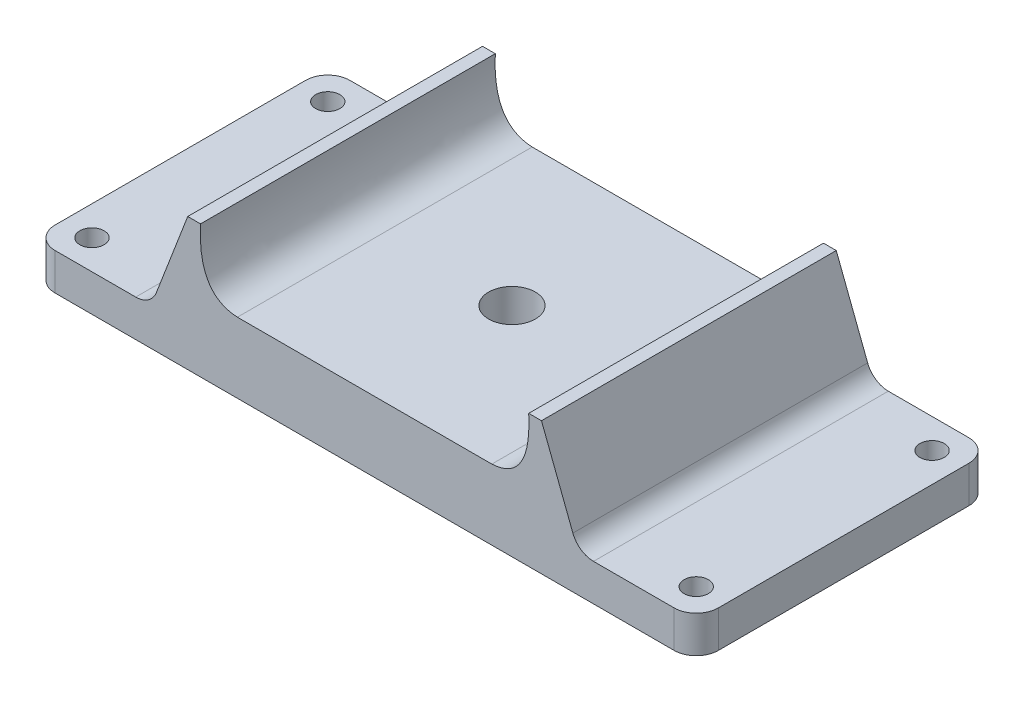
ISO-10303-21;
HEADER;
FILE_DESCRIPTION(('STEP AP214'),'2;1');
FILE_NAME('part.step','',(''),(''),'','','');
FILE_SCHEMA(('AUTOMOTIVE_DESIGN { 1 0 10303 214 1 1 1 1 }'));
ENDSEC;
DATA;
#1=APPLICATION_CONTEXT('core data for automotive mechanical design processes');
#2=APPLICATION_PROTOCOL_DEFINITION('international standard','automotive_design',2000,#1);
#3=PRODUCT_CONTEXT('',#1,'mechanical');
#4=PRODUCT('Part','Part','',(#3));
#5=PRODUCT_RELATED_PRODUCT_CATEGORY('part','',(#4));
#6=PRODUCT_DEFINITION_FORMATION('','',#4);
#7=PRODUCT_DEFINITION_CONTEXT('part definition',#1,'design');
#8=PRODUCT_DEFINITION('design','',#6,#7);
#9=PRODUCT_DEFINITION_SHAPE('','',#8);
#10=(LENGTH_UNIT() NAMED_UNIT(*) SI_UNIT(.MILLI.,.METRE.));
#11=(NAMED_UNIT(*) PLANE_ANGLE_UNIT() SI_UNIT($,.RADIAN.));
#12=(NAMED_UNIT(*) SI_UNIT($,.STERADIAN.) SOLID_ANGLE_UNIT());
#13=UNCERTAINTY_MEASURE_WITH_UNIT(LENGTH_MEASURE(1.E-05),#10,'distance_accuracy_value','');
#14=(GEOMETRIC_REPRESENTATION_CONTEXT(3) GLOBAL_UNCERTAINTY_ASSIGNED_CONTEXT((#13)) GLOBAL_UNIT_ASSIGNED_CONTEXT((#10,
#11,#12)) REPRESENTATION_CONTEXT('',''));
#15=CARTESIAN_POINT('',(0.,0.,0.));
#16=DIRECTION('',(0.,0.,1.));
#17=DIRECTION('',(1.,0.,0.));
#18=AXIS2_PLACEMENT_3D('',#15,#16,#17);
#19=CARTESIAN_POINT('',(0.,18.,0.));
#20=DIRECTION('',(0.,1.,0.));
#21=DIRECTION('',(0.,0.,1.));
#22=AXIS2_PLACEMENT_3D('',#19,#20,#21);
#23=PLANE('',#22);
#24=DIRECTION('',(0.,0.,1.));
#25=VECTOR('',#24,1.);
#26=CARTESIAN_POINT('',(-22.2664421870811,18.,-32.));
#27=LINE('',#26,#25);
#28=CARTESIAN_POINT('',(-22.2664421870811,18.,-20.));
#29=VERTEX_POINT('',#28);
#30=CARTESIAN_POINT('',(-22.2664421870811,18.,20.));
#31=VERTEX_POINT('',#30);
#32=EDGE_CURVE('E196',#29,#31,#27,.T.);
#33=ORIENTED_EDGE('',*,*,#32,.F.);
#34=DIRECTION('',(1.,0.,0.));
#35=VECTOR('',#34,1.);
#36=CARTESIAN_POINT('',(0.,18.,-20.));
#37=LINE('',#36,#35);
#38=CARTESIAN_POINT('',(-24.,18.,-20.));
#39=VERTEX_POINT('',#38);
#40=EDGE_CURVE('E273',#39,#29,#37,.T.);
#41=ORIENTED_EDGE('',*,*,#40,.F.);
#42=DIRECTION('',(0.,0.,1.));
#43=VECTOR('',#42,1.);
#44=CARTESIAN_POINT('',(-24.,18.,0.));
#45=LINE('',#44,#43);
#46=CARTESIAN_POINT('',(-24.,18.,20.));
#47=VERTEX_POINT('',#46);
#48=EDGE_CURVE('E277',#39,#47,#45,.T.);
#49=ORIENTED_EDGE('',*,*,#48,.T.);
#50=DIRECTION('',(1.,0.,0.));
#51=VECTOR('',#50,1.);
#52=CARTESIAN_POINT('',(0.,18.,20.));
#53=LINE('',#52,#51);
#54=EDGE_CURVE('E282',#47,#31,#53,.T.);
#55=ORIENTED_EDGE('',*,*,#54,.T.);
#56=EDGE_LOOP('',(#33,#41,#49,#55));
#57=FACE_BOUND('',#56,.T.);
#58=ADVANCED_FACE('F49',(#57),#23,.T.);
#59=CARTESIAN_POINT('',(0.,5.,-20.));
#60=DIRECTION('',(0.,0.,-1.));
#61=DIRECTION('',(-1.,0.,0.));
#62=AXIS2_PLACEMENT_3D('',#59,#60,#61);
#63=PLANE('',#62);
#64=DIRECTION('',(1.,0.,0.));
#65=VECTOR('',#64,1.);
#66=CARTESIAN_POINT('',(0.,0.,-20.));
#67=LINE('',#66,#65);
#68=CARTESIAN_POINT('',(-42.,0.,-20.));
#69=VERTEX_POINT('',#68);
#70=CARTESIAN_POINT('',(42.,0.,-20.));
#71=VERTEX_POINT('',#70);
#72=EDGE_CURVE('E285',#69,#71,#67,.T.);
#73=ORIENTED_EDGE('',*,*,#72,.F.);
#74=DIRECTION('',(0.,-1.,0.));
#75=VECTOR('',#74,1.);
#76=CARTESIAN_POINT('',(-42.,5.,-20.));
#77=LINE('',#76,#75);
#78=CARTESIAN_POINT('',(-42.,5.,-20.));
#79=VERTEX_POINT('',#78);
#80=EDGE_CURVE('E397',#69,#79,#77,.F.);
#81=ORIENTED_EDGE('',*,*,#80,.T.);
#82=DIRECTION('',(1.,0.,0.));
#83=VECTOR('',#82,1.);
#84=CARTESIAN_POINT('',(0.,5.,-20.));
#85=LINE('',#84,#83);
#86=CARTESIAN_POINT('',(-31.0603972947348,5.,-20.));
#87=VERTEX_POINT('',#86);
#88=EDGE_CURVE('E289',#79,#87,#85,.T.);
#89=ORIENTED_EDGE('',*,*,#88,.T.);
#90=CARTESIAN_POINT('',(-31.0603972947348,8.,-20.));
#91=DIRECTION('',(0.,0.,-1.));
#92=DIRECTION('',(-1.,0.,0.));
#93=AXIS2_PLACEMENT_3D('',#90,#91,#92);
#94=CIRCLE('',#93,3.);
#95=CARTESIAN_POINT('',(-28.2603604761256,6.92306276207338,-20.));
#96=VERTEX_POINT('',#95);
#97=EDGE_CURVE('E361',#87,#96,#94,.F.);
#98=ORIENTED_EDGE('',*,*,#97,.T.);
#99=DIRECTION('',(0.358979079308872,0.933345606203059,0.));
#100=VECTOR('',#99,1.);
#101=CARTESIAN_POINT('',(-24.,17.9999999999999,-20.));
#102=LINE('',#101,#100);
#103=EDGE_CURVE('E337',#96,#39,#102,.T.);
#104=ORIENTED_EDGE('',*,*,#103,.T.);
#105=ORIENTED_EDGE('',*,*,#40,.T.);
#106=CARTESIAN_POINT('',(-22.2664421870811,18.,-20.));
#107=CARTESIAN_POINT('',(-22.7015379766122,9.81972085349256,-20.));
#108=CARTESIAN_POINT('',(-17.2629045058751,9.53381189618557,-20.));
#109=B_SPLINE_CURVE_WITH_KNOTS('',2,(#106,#107,#108),.UNSPECIFIED.,.F.,.F.,(3,3),(0.,1.),.UNSPECIFIED.);
#110=CARTESIAN_POINT('',(-17.2629045058751,9.53381189618557,-20.));
#111=VERTEX_POINT('',#110);
#112=EDGE_CURVE('E223',#111,#29,#109,.F.);
#113=ORIENTED_EDGE('',*,*,#112,.F.);
#114=DIRECTION('',(-1.,0.,0.));
#115=VECTOR('',#114,1.);
#116=CARTESIAN_POINT('',(0.,9.53381189618557,-20.));
#117=LINE('',#116,#115);
#118=CARTESIAN_POINT('',(17.2629045058751,9.53381189618557,-20.));
#119=VERTEX_POINT('',#118);
#120=EDGE_CURVE('E185',#119,#111,#117,.T.);
#121=ORIENTED_EDGE('',*,*,#120,.F.);
#122=CARTESIAN_POINT('',(17.2629045058751,9.53381189618557,-20.));
#123=CARTESIAN_POINT('',(22.7015379766122,9.81972085349256,-20.));
#124=CARTESIAN_POINT('',(22.2664421870811,18.,-20.));
#125=B_SPLINE_CURVE_WITH_KNOTS('',2,(#122,#123,#124),.UNSPECIFIED.,.F.,.F.,(3,3),(0.,1.),.UNSPECIFIED.);
#126=CARTESIAN_POINT('',(22.2664421870811,18.,-20.));
#127=VERTEX_POINT('',#126);
#128=EDGE_CURVE('E217',#127,#119,#125,.F.);
#129=ORIENTED_EDGE('',*,*,#128,.F.);
#130=CARTESIAN_POINT('',(24.,18.,-20.));
#131=VERTEX_POINT('',#130);
#132=EDGE_CURVE('E272',#127,#131,#37,.T.);
#133=ORIENTED_EDGE('',*,*,#132,.T.);
#134=DIRECTION('',(-0.358979079308872,0.933345606203059,0.));
#135=VECTOR('',#134,1.);
#136=CARTESIAN_POINT('',(29.,5.,-20.));
#137=LINE('',#136,#135);
#138=CARTESIAN_POINT('',(28.2603604761256,6.92306276207338,-20.));
#139=VERTEX_POINT('',#138);
#140=EDGE_CURVE('E343',#131,#139,#137,.F.);
#141=ORIENTED_EDGE('',*,*,#140,.T.);
#142=CARTESIAN_POINT('',(31.0603972947348,8.,-20.));
#143=DIRECTION('',(0.,0.,-1.));
#144=DIRECTION('',(-1.,0.,0.));
#145=AXIS2_PLACEMENT_3D('',#142,#143,#144);
#146=CIRCLE('',#145,3.);
#147=CARTESIAN_POINT('',(31.0603972947348,5.,-20.));
#148=VERTEX_POINT('',#147);
#149=EDGE_CURVE('E371',#139,#148,#146,.F.);
#150=ORIENTED_EDGE('',*,*,#149,.T.);
#151=DIRECTION('',(1.,0.,0.));
#152=VECTOR('',#151,1.);
#153=CARTESIAN_POINT('',(0.,5.,-20.));
#154=LINE('',#153,#152);
#155=CARTESIAN_POINT('',(42.,5.,-20.));
#156=VERTEX_POINT('',#155);
#157=EDGE_CURVE('E242',#148,#156,#154,.T.);
#158=ORIENTED_EDGE('',*,*,#157,.T.);
#159=DIRECTION('',(0.,-1.,0.));
#160=VECTOR('',#159,1.);
#161=CARTESIAN_POINT('',(42.,5.,-20.));
#162=LINE('',#161,#160);
#163=EDGE_CURVE('E393',#156,#71,#162,.T.);
#164=ORIENTED_EDGE('',*,*,#163,.T.);
#165=EDGE_LOOP('',(#73,#81,#89,#98,#104,#105,#113,#121,#129,#133,#141,#150,#158,#164));
#166=FACE_BOUND('',#165,.T.);
#167=ADVANCED_FACE('F444',(#166),#63,.T.);
#168=CARTESIAN_POINT('',(-45.,5.,0.));
#169=DIRECTION('',(1.,0.,0.));
#170=DIRECTION('',(0.,0.,-1.));
#171=AXIS2_PLACEMENT_3D('',#168,#169,#170);
#172=PLANE('',#171);
#173=DIRECTION('',(0.,0.,1.));
#174=VECTOR('',#173,1.);
#175=CARTESIAN_POINT('',(-45.,5.,0.));
#176=LINE('',#175,#174);
#177=CARTESIAN_POINT('',(-45.,5.,-17.));
#178=VERTEX_POINT('',#177);
#179=CARTESIAN_POINT('',(-45.,5.,17.));
#180=VERTEX_POINT('',#179);
#181=EDGE_CURVE('E292',#178,#180,#176,.T.);
#182=ORIENTED_EDGE('',*,*,#181,.F.);
#183=DIRECTION('',(0.,-1.,0.));
#184=VECTOR('',#183,1.);
#185=CARTESIAN_POINT('',(-45.,0.,-17.));
#186=LINE('',#185,#184);
#187=CARTESIAN_POINT('',(-45.,0.,-17.));
#188=VERTEX_POINT('',#187);
#189=EDGE_CURVE('E377',#178,#188,#186,.T.);
#190=ORIENTED_EDGE('',*,*,#189,.T.);
#191=DIRECTION('',(0.,0.,1.));
#192=VECTOR('',#191,1.);
#193=CARTESIAN_POINT('',(-45.,0.,0.));
#194=LINE('',#193,#192);
#195=CARTESIAN_POINT('',(-45.,0.,17.));
#196=VERTEX_POINT('',#195);
#197=EDGE_CURVE('E312',#188,#196,#194,.T.);
#198=ORIENTED_EDGE('',*,*,#197,.T.);
#199=DIRECTION('',(0.,-1.,0.));
#200=VECTOR('',#199,1.);
#201=CARTESIAN_POINT('',(-45.,5.,17.));
#202=LINE('',#201,#200);
#203=EDGE_CURVE('E374',#196,#180,#202,.F.);
#204=ORIENTED_EDGE('',*,*,#203,.T.);
#205=EDGE_LOOP('',(#182,#190,#198,#204));
#206=FACE_BOUND('',#205,.T.);
#207=ADVANCED_FACE('F452',(#206),#172,.F.);
#208=CARTESIAN_POINT('',(-41.,5.,-16.));
#209=DIRECTION('',(0.,-1.,0.));
#210=DIRECTION('',(0.,0.,-1.));
#211=AXIS2_PLACEMENT_3D('',#208,#209,#210);
#212=CYLINDRICAL_SURFACE('',#211,1.65);
#213=CARTESIAN_POINT('',(-41.,5.,-16.));
#214=DIRECTION('',(0.,1.,0.));
#215=DIRECTION('',(0.,0.,1.));
#216=AXIS2_PLACEMENT_3D('',#213,#214,#215);
#217=CIRCLE('',#216,1.65);
#218=CARTESIAN_POINT('',(-41.,5.,-14.35));
#219=VERTEX_POINT('',#218);
#220=EDGE_CURVE('E300',#219,#219,#217,.T.);
#221=ORIENTED_EDGE('',*,*,#220,.T.);
#222=EDGE_LOOP('',(#221));
#223=FACE_BOUND('',#222,.T.);
#224=CARTESIAN_POINT('',(-41.,0.,-16.));
#225=DIRECTION('',(0.,1.,0.));
#226=DIRECTION('',(0.,0.,1.));
#227=AXIS2_PLACEMENT_3D('',#224,#225,#226);
#228=CIRCLE('',#227,1.65);
#229=CARTESIAN_POINT('',(-41.,0.,-14.35));
#230=VERTEX_POINT('',#229);
#231=EDGE_CURVE('E319',#230,#230,#228,.T.);
#232=ORIENTED_EDGE('',*,*,#231,.F.);
#233=EDGE_LOOP('',(#232));
#234=FACE_BOUND('',#233,.T.);
#235=ADVANCED_FACE('F657',(#223,#234),#212,.F.);
#236=CARTESIAN_POINT('',(0.,5.,20.));
#237=DIRECTION('',(0.,0.,-1.));
#238=DIRECTION('',(-1.,0.,0.));
#239=AXIS2_PLACEMENT_3D('',#236,#237,#238);
#240=PLANE('',#239);
#241=DIRECTION('',(1.,0.,0.));
#242=VECTOR('',#241,1.);
#243=CARTESIAN_POINT('',(0.,0.,20.));
#244=LINE('',#243,#242);
#245=CARTESIAN_POINT('',(-42.,0.,20.));
#246=VERTEX_POINT('',#245);
#247=CARTESIAN_POINT('',(42.,0.,20.));
#248=VERTEX_POINT('',#247);
#249=EDGE_CURVE('E316',#246,#248,#244,.T.);
#250=ORIENTED_EDGE('',*,*,#249,.T.);
#251=DIRECTION('',(0.,-1.,0.));
#252=VECTOR('',#251,1.);
#253=CARTESIAN_POINT('',(42.,5.,20.));
#254=LINE('',#253,#252);
#255=CARTESIAN_POINT('',(42.,5.,20.));
#256=VERTEX_POINT('',#255);
#257=EDGE_CURVE('E11',#248,#256,#254,.F.);
#258=ORIENTED_EDGE('',*,*,#257,.T.);
#259=DIRECTION('',(1.,0.,0.));
#260=VECTOR('',#259,1.);
#261=CARTESIAN_POINT('',(0.,5.,20.));
#262=LINE('',#261,#260);
#263=CARTESIAN_POINT('',(31.0603972947348,5.,20.));
#264=VERTEX_POINT('',#263);
#265=EDGE_CURVE('E247',#264,#256,#262,.T.);
#266=ORIENTED_EDGE('',*,*,#265,.F.);
#267=CARTESIAN_POINT('',(31.0603972947348,8.,20.));
#268=DIRECTION('',(0.,0.,-1.));
#269=DIRECTION('',(-1.,0.,0.));
#270=AXIS2_PLACEMENT_3D('',#267,#268,#269);
#271=CIRCLE('',#270,3.);
#272=CARTESIAN_POINT('',(28.2603604761256,6.92306276207338,20.));
#273=VERTEX_POINT('',#272);
#274=EDGE_CURVE('E368',#264,#273,#271,.T.);
#275=ORIENTED_EDGE('',*,*,#274,.T.);
#276=DIRECTION('',(0.358979079308872,-0.933345606203059,0.));
#277=VECTOR('',#276,1.);
#278=CARTESIAN_POINT('',(25.2628865979381,14.7164948453609,20.));
#279=LINE('',#278,#277);
#280=CARTESIAN_POINT('',(24.,18.,20.));
#281=VERTEX_POINT('',#280);
#282=EDGE_CURVE('E340',#273,#281,#279,.F.);
#283=ORIENTED_EDGE('',*,*,#282,.T.);
#284=CARTESIAN_POINT('',(22.2664421870811,18.,20.));
#285=VERTEX_POINT('',#284);
#286=EDGE_CURVE('E281',#285,#281,#53,.T.);
#287=ORIENTED_EDGE('',*,*,#286,.F.);
#288=CARTESIAN_POINT('',(17.2629045058751,9.53381189618557,20.));
#289=CARTESIAN_POINT('',(22.7015379766122,9.81972085349256,20.));
#290=CARTESIAN_POINT('',(22.2664421870811,18.,20.));
#291=B_SPLINE_CURVE_WITH_KNOTS('',2,(#288,#289,#290),.UNSPECIFIED.,.F.,.F.,(3,3),(0.,1.),.UNSPECIFIED.);
#292=CARTESIAN_POINT('',(17.2629045058751,9.53381189618557,20.));
#293=VERTEX_POINT('',#292);
#294=EDGE_CURVE('E190',#293,#285,#291,.T.);
#295=ORIENTED_EDGE('',*,*,#294,.F.);
#296=DIRECTION('',(1.,0.,0.));
#297=VECTOR('',#296,1.);
#298=CARTESIAN_POINT('',(-17.2629045058751,9.53381189618557,20.));
#299=LINE('',#298,#297);
#300=CARTESIAN_POINT('',(-17.2629045058751,9.53381189618557,20.));
#301=VERTEX_POINT('',#300);
#302=EDGE_CURVE('E182',#301,#293,#299,.T.);
#303=ORIENTED_EDGE('',*,*,#302,.F.);
#304=CARTESIAN_POINT('',(-22.2664421870811,18.,20.));
#305=CARTESIAN_POINT('',(-22.7015379766122,9.81972085349256,20.));
#306=CARTESIAN_POINT('',(-17.2629045058751,9.53381189618557,20.));
#307=B_SPLINE_CURVE_WITH_KNOTS('',2,(#304,#305,#306),.UNSPECIFIED.,.F.,.F.,(3,3),(0.,1.),.UNSPECIFIED.);
#308=EDGE_CURVE('E193',#31,#301,#307,.T.);
#309=ORIENTED_EDGE('',*,*,#308,.F.);
#310=ORIENTED_EDGE('',*,*,#54,.F.);
#311=DIRECTION('',(-0.358979079308872,-0.933345606203059,0.));
#312=VECTOR('',#311,1.);
#313=CARTESIAN_POINT('',(-25.2628865979381,14.7164948453609,20.));
#314=LINE('',#313,#312);
#315=CARTESIAN_POINT('',(-28.2603604761256,6.92306276207338,20.));
#316=VERTEX_POINT('',#315);
#317=EDGE_CURVE('E330',#47,#316,#314,.T.);
#318=ORIENTED_EDGE('',*,*,#317,.T.);
#319=CARTESIAN_POINT('',(-31.0603972947348,8.,20.));
#320=DIRECTION('',(0.,0.,-1.));
#321=DIRECTION('',(-1.,0.,0.));
#322=AXIS2_PLACEMENT_3D('',#319,#320,#321);
#323=CIRCLE('',#322,3.);
#324=CARTESIAN_POINT('',(-31.0603972947348,5.,20.));
#325=VERTEX_POINT('',#324);
#326=EDGE_CURVE('E364',#316,#325,#323,.T.);
#327=ORIENTED_EDGE('',*,*,#326,.T.);
#328=DIRECTION('',(1.,0.,0.));
#329=VECTOR('',#328,1.);
#330=CARTESIAN_POINT('',(0.,5.,20.));
#331=LINE('',#330,#329);
#332=CARTESIAN_POINT('',(-42.,5.,20.));
#333=VERTEX_POINT('',#332);
#334=EDGE_CURVE('E297',#333,#325,#331,.T.);
#335=ORIENTED_EDGE('',*,*,#334,.F.);
#336=DIRECTION('',(0.,-1.,0.));
#337=VECTOR('',#336,1.);
#338=CARTESIAN_POINT('',(-42.,5.,20.));
#339=LINE('',#338,#337);
#340=EDGE_CURVE('E58',#333,#246,#339,.T.);
#341=ORIENTED_EDGE('',*,*,#340,.T.);
#342=EDGE_LOOP('',(#250,#258,#266,#275,#283,#287,#295,#303,#309,#310,#318,#327,#335,#341));
#343=FACE_BOUND('',#342,.T.);
#344=ADVANCED_FACE('F201',(#343),#240,.F.);
#345=CARTESIAN_POINT('',(-41.,5.,16.));
#346=DIRECTION('',(0.,-1.,0.));
#347=DIRECTION('',(0.,0.,-1.));
#348=AXIS2_PLACEMENT_3D('',#345,#346,#347);
#349=CYLINDRICAL_SURFACE('',#348,1.65);
#350=CARTESIAN_POINT('',(-41.,5.,16.));
#351=DIRECTION('',(0.,1.,0.));
#352=DIRECTION('',(0.,0.,1.));
#353=AXIS2_PLACEMENT_3D('',#350,#351,#352);
#354=CIRCLE('',#353,1.65);
#355=CARTESIAN_POINT('',(-41.,5.,17.65));
#356=VERTEX_POINT('',#355);
#357=EDGE_CURVE('E304',#356,#356,#354,.F.);
#358=ORIENTED_EDGE('',*,*,#357,.F.);
#359=EDGE_LOOP('',(#358));
#360=FACE_BOUND('',#359,.T.);
#361=CARTESIAN_POINT('',(-41.,0.,16.));
#362=DIRECTION('',(0.,1.,0.));
#363=DIRECTION('',(0.,0.,1.));
#364=AXIS2_PLACEMENT_3D('',#361,#362,#363);
#365=CIRCLE('',#364,1.65);
#366=CARTESIAN_POINT('',(-41.,0.,17.65));
#367=VERTEX_POINT('',#366);
#368=EDGE_CURVE('E293',#367,#367,#365,.F.);
#369=ORIENTED_EDGE('',*,*,#368,.T.);
#370=EDGE_LOOP('',(#369));
#371=FACE_BOUND('',#370,.T.);
#372=ADVANCED_FACE('F642',(#360,#371),#349,.F.);
#373=CARTESIAN_POINT('',(0.,5.,0.));
#374=DIRECTION('',(0.,1.,0.));
#375=DIRECTION('',(0.,0.,1.));
#376=AXIS2_PLACEMENT_3D('',#373,#374,#375);
#377=PLANE('',#376);
#378=ORIENTED_EDGE('',*,*,#88,.F.);
#379=CARTESIAN_POINT('',(-42.,5.,-17.));
#380=DIRECTION('',(0.,1.,0.));
#381=DIRECTION('',(0.,0.,1.));
#382=AXIS2_PLACEMENT_3D('',#379,#380,#381);
#383=CIRCLE('',#382,3.);
#384=EDGE_CURVE('E403',#79,#178,#383,.T.);
#385=ORIENTED_EDGE('',*,*,#384,.T.);
#386=ORIENTED_EDGE('',*,*,#181,.T.);
#387=CARTESIAN_POINT('',(-42.,5.,17.));
#388=DIRECTION('',(0.,1.,0.));
#389=DIRECTION('',(0.,0.,1.));
#390=AXIS2_PLACEMENT_3D('',#387,#388,#389);
#391=CIRCLE('',#390,3.);
#392=EDGE_CURVE('E400',#180,#333,#391,.T.);
#393=ORIENTED_EDGE('',*,*,#392,.T.);
#394=ORIENTED_EDGE('',*,*,#334,.T.);
#395=DIRECTION('',(0.,0.,-1.));
#396=VECTOR('',#395,1.);
#397=CARTESIAN_POINT('',(-31.0603972947348,5.,0.));
#398=LINE('',#397,#396);
#399=EDGE_CURVE('E347',#325,#87,#398,.T.);
#400=ORIENTED_EDGE('',*,*,#399,.T.);
#401=EDGE_LOOP('',(#378,#385,#386,#393,#394,#400));
#402=FACE_BOUND('',#401,.T.);
#403=ORIENTED_EDGE('',*,*,#220,.F.);
#404=EDGE_LOOP('',(#403));
#405=FACE_BOUND('',#404,.T.);
#406=ORIENTED_EDGE('',*,*,#357,.T.);
#407=EDGE_LOOP('',(#406));
#408=FACE_BOUND('',#407,.T.);
#409=ADVANCED_FACE('F456',(#402,#405,#408),#377,.T.);
#410=CARTESIAN_POINT('',(0.,0.,0.));
#411=DIRECTION('',(0.,1.,0.));
#412=DIRECTION('',(0.,0.,1.));
#413=AXIS2_PLACEMENT_3D('',#410,#411,#412);
#414=PLANE('',#413);
#415=ORIENTED_EDGE('',*,*,#197,.F.);
#416=CARTESIAN_POINT('',(-42.,0.,-17.));
#417=DIRECTION('',(0.,1.,0.));
#418=DIRECTION('',(0.,0.,1.));
#419=AXIS2_PLACEMENT_3D('',#416,#417,#418);
#420=CIRCLE('',#419,3.);
#421=EDGE_CURVE('E390',#188,#69,#420,.F.);
#422=ORIENTED_EDGE('',*,*,#421,.T.);
#423=ORIENTED_EDGE('',*,*,#72,.T.);
#424=CARTESIAN_POINT('',(42.,0.,-17.));
#425=DIRECTION('',(0.,1.,0.));
#426=DIRECTION('',(0.,0.,1.));
#427=AXIS2_PLACEMENT_3D('',#424,#425,#426);
#428=CIRCLE('',#427,3.);
#429=CARTESIAN_POINT('',(45.,0.,-17.));
#430=VERTEX_POINT('',#429);
#431=EDGE_CURVE('E387',#71,#430,#428,.F.);
#432=ORIENTED_EDGE('',*,*,#431,.T.);
#433=DIRECTION('',(0.,0.,1.));
#434=VECTOR('',#433,1.);
#435=CARTESIAN_POINT('',(45.,0.,0.));
#436=LINE('',#435,#434);
#437=CARTESIAN_POINT('',(45.,0.,17.));
#438=VERTEX_POINT('',#437);
#439=EDGE_CURVE('E261',#430,#438,#436,.T.);
#440=ORIENTED_EDGE('',*,*,#439,.T.);
#441=CARTESIAN_POINT('',(42.,0.,17.));
#442=DIRECTION('',(0.,1.,0.));
#443=DIRECTION('',(0.,0.,1.));
#444=AXIS2_PLACEMENT_3D('',#441,#442,#443);
#445=CIRCLE('',#444,3.);
#446=EDGE_CURVE('E384',#438,#248,#445,.F.);
#447=ORIENTED_EDGE('',*,*,#446,.T.);
#448=ORIENTED_EDGE('',*,*,#249,.F.);
#449=CARTESIAN_POINT('',(-42.,0.,17.));
#450=DIRECTION('',(0.,1.,0.));
#451=DIRECTION('',(0.,0.,1.));
#452=AXIS2_PLACEMENT_3D('',#449,#450,#451);
#453=CIRCLE('',#452,3.);
#454=EDGE_CURVE('E381',#246,#196,#453,.F.);
#455=ORIENTED_EDGE('',*,*,#454,.T.);
#456=EDGE_LOOP('',(#415,#422,#423,#432,#440,#447,#448,#455));
#457=FACE_BOUND('',#456,.T.);
#458=ORIENTED_EDGE('',*,*,#231,.T.);
#459=EDGE_LOOP('',(#458));
#460=FACE_BOUND('',#459,.T.);
#461=ORIENTED_EDGE('',*,*,#368,.F.);
#462=EDGE_LOOP('',(#461));
#463=FACE_BOUND('',#462,.T.);
#464=CARTESIAN_POINT('',(0.,0.,0.));
#465=DIRECTION('',(0.,1.,0.));
#466=DIRECTION('',(0.,0.,1.));
#467=AXIS2_PLACEMENT_3D('',#464,#465,#466);
#468=CIRCLE('',#467,3.175);
#469=CARTESIAN_POINT('',(0.,0.,3.175));
#470=VERTEX_POINT('',#469);
#471=EDGE_CURVE('E257',#470,#470,#468,.T.);
#472=ORIENTED_EDGE('',*,*,#471,.T.);
#473=EDGE_LOOP('',(#472));
#474=FACE_BOUND('',#473,.T.);
#475=CARTESIAN_POINT('',(41.,0.,16.));
#476=DIRECTION('',(0.,1.,0.));
#477=DIRECTION('',(0.,0.,1.));
#478=AXIS2_PLACEMENT_3D('',#475,#476,#477);
#479=CIRCLE('',#478,1.65);
#480=CARTESIAN_POINT('',(41.,0.,17.65));
#481=VERTEX_POINT('',#480);
#482=EDGE_CURVE('E237',#481,#481,#479,.T.);
#483=ORIENTED_EDGE('',*,*,#482,.T.);
#484=EDGE_LOOP('',(#483));
#485=FACE_BOUND('',#484,.T.);
#486=CARTESIAN_POINT('',(41.,0.,-16.));
#487=DIRECTION('',(0.,1.,0.));
#488=DIRECTION('',(0.,0.,1.));
#489=AXIS2_PLACEMENT_3D('',#486,#487,#488);
#490=CIRCLE('',#489,1.65);
#491=CARTESIAN_POINT('',(41.,0.,-14.35));
#492=VERTEX_POINT('',#491);
#493=EDGE_CURVE('E243',#492,#492,#490,.F.);
#494=ORIENTED_EDGE('',*,*,#493,.F.);
#495=EDGE_LOOP('',(#494));
#496=FACE_BOUND('',#495,.T.);
#497=ADVANCED_FACE('F426',(#457,#460,#463,#474,#485,#496),#414,.F.);
#498=CARTESIAN_POINT('',(0.,18.,0.));
#499=DIRECTION('',(0.,-1.,0.));
#500=DIRECTION('',(0.,0.,-1.));
#501=AXIS2_PLACEMENT_3D('',#498,#499,#500);
#502=CYLINDRICAL_SURFACE('',#501,3.175);
#503=CARTESIAN_POINT('',(0.,9.53381189618557,0.));
#504=DIRECTION('',(0.,-1.,0.));
#505=DIRECTION('',(0.,0.,-1.));
#506=AXIS2_PLACEMENT_3D('',#503,#504,#505);
#507=CIRCLE('',#506,3.175);
#508=CARTESIAN_POINT('',(0.,9.53381189618557,-3.175));
#509=VERTEX_POINT('',#508);
#510=EDGE_CURVE('E231',#509,#509,#507,.T.);
#511=ORIENTED_EDGE('',*,*,#510,.F.);
#512=EDGE_LOOP('',(#511));
#513=FACE_BOUND('',#512,.T.);
#514=ORIENTED_EDGE('',*,*,#471,.F.);
#515=EDGE_LOOP('',(#514));
#516=FACE_BOUND('',#515,.T.);
#517=ADVANCED_FACE('F474',(#513,#516),#502,.F.);
#518=DIRECTION('',(0.,0.,1.));
#519=VECTOR('',#518,1.);
#520=CARTESIAN_POINT('',(22.2664421870811,18.,-32.));
#521=LINE('',#520,#519);
#522=EDGE_CURVE('E308',#285,#127,#521,.F.);
#523=ORIENTED_EDGE('',*,*,#522,.F.);
#524=ORIENTED_EDGE('',*,*,#286,.T.);
#525=DIRECTION('',(0.,0.,1.));
#526=VECTOR('',#525,1.);
#527=CARTESIAN_POINT('',(24.,18.,0.));
#528=LINE('',#527,#526);
#529=EDGE_CURVE('E268',#131,#281,#528,.T.);
#530=ORIENTED_EDGE('',*,*,#529,.F.);
#531=ORIENTED_EDGE('',*,*,#132,.F.);
#532=EDGE_LOOP('',(#523,#524,#530,#531));
#533=FACE_BOUND('',#532,.T.);
#534=ADVANCED_FACE('F465',(#533),#23,.T.);
#535=CARTESIAN_POINT('',(45.,5.,0.));
#536=DIRECTION('',(1.,0.,0.));
#537=DIRECTION('',(0.,0.,-1.));
#538=AXIS2_PLACEMENT_3D('',#535,#536,#537);
#539=PLANE('',#538);
#540=ORIENTED_EDGE('',*,*,#439,.F.);
#541=DIRECTION('',(0.,-1.,0.));
#542=VECTOR('',#541,1.);
#543=CARTESIAN_POINT('',(45.,5.,-17.));
#544=LINE('',#543,#542);
#545=CARTESIAN_POINT('',(45.,5.,-17.));
#546=VERTEX_POINT('',#545);
#547=EDGE_CURVE('E410',#430,#546,#544,.F.);
#548=ORIENTED_EDGE('',*,*,#547,.T.);
#549=DIRECTION('',(0.,0.,1.));
#550=VECTOR('',#549,1.);
#551=CARTESIAN_POINT('',(45.,5.,0.));
#552=LINE('',#551,#550);
#553=CARTESIAN_POINT('',(45.,5.,17.));
#554=VERTEX_POINT('',#553);
#555=EDGE_CURVE('E250',#546,#554,#552,.T.);
#556=ORIENTED_EDGE('',*,*,#555,.T.);
#557=DIRECTION('',(0.,-1.,0.));
#558=VECTOR('',#557,1.);
#559=CARTESIAN_POINT('',(45.,0.,17.));
#560=LINE('',#559,#558);
#561=EDGE_CURVE('E406',#554,#438,#560,.T.);
#562=ORIENTED_EDGE('',*,*,#561,.T.);
#563=EDGE_LOOP('',(#540,#548,#556,#562));
#564=FACE_BOUND('',#563,.T.);
#565=ADVANCED_FACE('F433',(#564),#539,.T.);
#566=CARTESIAN_POINT('',(41.,5.,16.));
#567=DIRECTION('',(0.,-1.,0.));
#568=DIRECTION('',(0.,0.,-1.));
#569=AXIS2_PLACEMENT_3D('',#566,#567,#568);
#570=CYLINDRICAL_SURFACE('',#569,1.65);
#571=CARTESIAN_POINT('',(41.,5.,16.));
#572=DIRECTION('',(0.,1.,0.));
#573=DIRECTION('',(0.,0.,1.));
#574=AXIS2_PLACEMENT_3D('',#571,#572,#573);
#575=CIRCLE('',#574,1.65);
#576=CARTESIAN_POINT('',(41.,5.,17.65));
#577=VERTEX_POINT('',#576);
#578=EDGE_CURVE('E238',#577,#577,#575,.T.);
#579=ORIENTED_EDGE('',*,*,#578,.T.);
#580=EDGE_LOOP('',(#579));
#581=FACE_BOUND('',#580,.T.);
#582=ORIENTED_EDGE('',*,*,#482,.F.);
#583=EDGE_LOOP('',(#582));
#584=FACE_BOUND('',#583,.T.);
#585=ADVANCED_FACE('F480',(#581,#584),#570,.F.);
#586=CARTESIAN_POINT('',(41.,5.,-16.));
#587=DIRECTION('',(0.,-1.,0.));
#588=DIRECTION('',(0.,0.,-1.));
#589=AXIS2_PLACEMENT_3D('',#586,#587,#588);
#590=CYLINDRICAL_SURFACE('',#589,1.65);
#591=CARTESIAN_POINT('',(41.,5.,-16.));
#592=DIRECTION('',(0.,1.,0.));
#593=DIRECTION('',(0.,0.,1.));
#594=AXIS2_PLACEMENT_3D('',#591,#592,#593);
#595=CIRCLE('',#594,1.65);
#596=CARTESIAN_POINT('',(41.,5.,-14.35));
#597=VERTEX_POINT('',#596);
#598=EDGE_CURVE('E253',#597,#597,#595,.F.);
#599=ORIENTED_EDGE('',*,*,#598,.F.);
#600=EDGE_LOOP('',(#599));
#601=FACE_BOUND('',#600,.T.);
#602=ORIENTED_EDGE('',*,*,#493,.T.);
#603=EDGE_LOOP('',(#602));
#604=FACE_BOUND('',#603,.T.);
#605=ADVANCED_FACE('F599',(#601,#604),#590,.F.);
#606=CARTESIAN_POINT('',(0.,5.,0.));
#607=DIRECTION('',(0.,1.,0.));
#608=DIRECTION('',(0.,0.,1.));
#609=AXIS2_PLACEMENT_3D('',#606,#607,#608);
#610=PLANE('',#609);
#611=ORIENTED_EDGE('',*,*,#578,.F.);
#612=EDGE_LOOP('',(#611));
#613=FACE_BOUND('',#612,.T.);
#614=ORIENTED_EDGE('',*,*,#555,.F.);
#615=CARTESIAN_POINT('',(42.,5.,-17.));
#616=DIRECTION('',(0.,1.,0.));
#617=DIRECTION('',(0.,0.,1.));
#618=AXIS2_PLACEMENT_3D('',#615,#616,#617);
#619=CIRCLE('',#618,3.);
#620=EDGE_CURVE('E415',#546,#156,#619,.T.);
#621=ORIENTED_EDGE('',*,*,#620,.T.);
#622=ORIENTED_EDGE('',*,*,#157,.F.);
#623=DIRECTION('',(0.,0.,-1.));
#624=VECTOR('',#623,1.);
#625=CARTESIAN_POINT('',(31.0603972947348,5.,0.));
#626=LINE('',#625,#624);
#627=EDGE_CURVE('E354',#148,#264,#626,.F.);
#628=ORIENTED_EDGE('',*,*,#627,.T.);
#629=ORIENTED_EDGE('',*,*,#265,.T.);
#630=CARTESIAN_POINT('',(42.,5.,17.));
#631=DIRECTION('',(0.,1.,0.));
#632=DIRECTION('',(0.,0.,1.));
#633=AXIS2_PLACEMENT_3D('',#630,#631,#632);
#634=CIRCLE('',#633,3.);
#635=EDGE_CURVE('E70',#256,#554,#634,.T.);
#636=ORIENTED_EDGE('',*,*,#635,.T.);
#637=EDGE_LOOP('',(#614,#621,#622,#628,#629,#636));
#638=FACE_BOUND('',#637,.T.);
#639=ORIENTED_EDGE('',*,*,#598,.T.);
#640=EDGE_LOOP('',(#639));
#641=FACE_BOUND('',#640,.T.);
#642=ADVANCED_FACE('F436',(#613,#638,#641),#610,.T.);
#643=CARTESIAN_POINT('',(-22.2664421870811,18.,-32.));
#644=CARTESIAN_POINT('',(-22.7015379766122,9.81972085349256,-32.));
#645=CARTESIAN_POINT('',(-17.2629045058751,9.53381189618557,-32.));
#646=B_SPLINE_CURVE_WITH_KNOTS('',2,(#643,#644,#645),.UNSPECIFIED.,.F.,.F.,(3,3),(0.,1.),.UNSPECIFIED.);
#647=DIRECTION('',(0.,0.,1.));
#648=VECTOR('',#647,1.);
#649=SURFACE_OF_LINEAR_EXTRUSION('',#646,#648);
#650=ORIENTED_EDGE('',*,*,#112,.T.);
#651=ORIENTED_EDGE('',*,*,#32,.T.);
#652=ORIENTED_EDGE('',*,*,#308,.T.);
#653=DIRECTION('',(0.,0.,1.));
#654=VECTOR('',#653,1.);
#655=CARTESIAN_POINT('',(-17.2629045058751,9.53381189618557,-32.));
#656=LINE('',#655,#654);
#657=EDGE_CURVE('E176',#111,#301,#656,.T.);
#658=ORIENTED_EDGE('',*,*,#657,.F.);
#659=EDGE_LOOP('',(#650,#651,#652,#658));
#660=FACE_BOUND('',#659,.T.);
#661=ADVANCED_FACE('F194',(#660),#649,.F.);
#662=CARTESIAN_POINT('',(17.2629045058751,9.53381189618557,-32.));
#663=CARTESIAN_POINT('',(22.7015379766122,9.81972085349256,-32.));
#664=CARTESIAN_POINT('',(22.2664421870811,18.,-32.));
#665=B_SPLINE_CURVE_WITH_KNOTS('',2,(#662,#663,#664),.UNSPECIFIED.,.F.,.F.,(3,3),(0.,1.),.UNSPECIFIED.);
#666=DIRECTION('',(0.,0.,1.));
#667=VECTOR('',#666,1.);
#668=SURFACE_OF_LINEAR_EXTRUSION('',#665,#667);
#669=ORIENTED_EDGE('',*,*,#128,.T.);
#670=DIRECTION('',(0.,0.,1.));
#671=VECTOR('',#670,1.);
#672=CARTESIAN_POINT('',(17.2629045058751,9.53381189618557,-32.));
#673=LINE('',#672,#671);
#674=EDGE_CURVE('E189',#119,#293,#673,.T.);
#675=ORIENTED_EDGE('',*,*,#674,.T.);
#676=ORIENTED_EDGE('',*,*,#294,.T.);
#677=ORIENTED_EDGE('',*,*,#522,.T.);
#678=EDGE_LOOP('',(#669,#675,#676,#677));
#679=FACE_BOUND('',#678,.T.);
#680=ADVANCED_FACE('F564',(#679),#668,.F.);
#681=CARTESIAN_POINT('',(-17.2629045058751,9.53381189618557,-32.));
#682=DIRECTION('',(0.,-1.,0.));
#683=DIRECTION('',(0.,0.,-1.));
#684=AXIS2_PLACEMENT_3D('',#681,#682,#683);
#685=PLANE('',#684);
#686=ORIENTED_EDGE('',*,*,#120,.T.);
#687=ORIENTED_EDGE('',*,*,#657,.T.);
#688=ORIENTED_EDGE('',*,*,#302,.T.);
#689=ORIENTED_EDGE('',*,*,#674,.F.);
#690=EDGE_LOOP('',(#686,#687,#688,#689));
#691=FACE_BOUND('',#690,.T.);
#692=ORIENTED_EDGE('',*,*,#510,.T.);
#693=EDGE_LOOP('',(#692));
#694=FACE_BOUND('',#693,.T.);
#695=ADVANCED_FACE('F178',(#691,#694),#685,.F.);
#696=CARTESIAN_POINT('',(-24.,17.9999999999999,0.));
#697=DIRECTION('',(0.933345606203059,-0.358979079308872,0.));
#698=DIRECTION('',(0.,0.,1.));
#699=AXIS2_PLACEMENT_3D('',#696,#697,#698);
#700=PLANE('',#699);
#701=ORIENTED_EDGE('',*,*,#103,.F.);
#702=DIRECTION('',(0.,0.,-1.));
#703=VECTOR('',#702,1.);
#704=CARTESIAN_POINT('',(-28.2603604761256,6.92306276207338,0.));
#705=LINE('',#704,#703);
#706=EDGE_CURVE('E351',#96,#316,#705,.F.);
#707=ORIENTED_EDGE('',*,*,#706,.T.);
#708=ORIENTED_EDGE('',*,*,#317,.F.);
#709=ORIENTED_EDGE('',*,*,#48,.F.);
#710=EDGE_LOOP('',(#701,#707,#708,#709));
#711=FACE_BOUND('',#710,.T.);
#712=ADVANCED_FACE('F551',(#711),#700,.F.);
#713=CARTESIAN_POINT('',(29.,5.,0.));
#714=DIRECTION('',(0.933345606203058,0.358979079308872,0.));
#715=DIRECTION('',(0.,0.,-1.));
#716=AXIS2_PLACEMENT_3D('',#713,#714,#715);
#717=PLANE('',#716);
#718=ORIENTED_EDGE('',*,*,#282,.F.);
#719=DIRECTION('',(0.,0.,1.));
#720=VECTOR('',#719,1.);
#721=CARTESIAN_POINT('',(28.2603604761256,6.92306276207338,0.));
#722=LINE('',#721,#720);
#723=EDGE_CURVE('E358',#273,#139,#722,.F.);
#724=ORIENTED_EDGE('',*,*,#723,.T.);
#725=ORIENTED_EDGE('',*,*,#140,.F.);
#726=ORIENTED_EDGE('',*,*,#529,.T.);
#727=EDGE_LOOP('',(#718,#724,#725,#726));
#728=FACE_BOUND('',#727,.T.);
#729=ADVANCED_FACE('F496',(#728),#717,.T.);
#730=CARTESIAN_POINT('',(-31.0603972947348,8.,0.));
#731=DIRECTION('',(0.,0.,-1.));
#732=DIRECTION('',(-1.,0.,0.));
#733=AXIS2_PLACEMENT_3D('',#730,#731,#732);
#734=CYLINDRICAL_SURFACE('',#733,3.);
#735=ORIENTED_EDGE('',*,*,#326,.F.);
#736=ORIENTED_EDGE('',*,*,#706,.F.);
#737=ORIENTED_EDGE('',*,*,#97,.F.);
#738=ORIENTED_EDGE('',*,*,#399,.F.);
#739=EDGE_LOOP('',(#735,#736,#737,#738));
#740=FACE_BOUND('',#739,.T.);
#741=ADVANCED_FACE('F502',(#740),#734,.F.);
#742=CARTESIAN_POINT('',(31.0603972947348,8.,0.));
#743=DIRECTION('',(0.,0.,-1.));
#744=DIRECTION('',(-1.,0.,0.));
#745=AXIS2_PLACEMENT_3D('',#742,#743,#744);
#746=CYLINDRICAL_SURFACE('',#745,3.);
#747=ORIENTED_EDGE('',*,*,#149,.F.);
#748=ORIENTED_EDGE('',*,*,#723,.F.);
#749=ORIENTED_EDGE('',*,*,#274,.F.);
#750=ORIENTED_EDGE('',*,*,#627,.F.);
#751=EDGE_LOOP('',(#747,#748,#749,#750));
#752=FACE_BOUND('',#751,.T.);
#753=ADVANCED_FACE('F499',(#752),#746,.F.);
#754=CARTESIAN_POINT('',(-42.,5.,-17.));
#755=DIRECTION('',(0.,1.,0.));
#756=DIRECTION('',(0.,0.,1.));
#757=AXIS2_PLACEMENT_3D('',#754,#755,#756);
#758=CYLINDRICAL_SURFACE('',#757,3.);
#759=ORIENTED_EDGE('',*,*,#384,.F.);
#760=ORIENTED_EDGE('',*,*,#80,.F.);
#761=ORIENTED_EDGE('',*,*,#421,.F.);
#762=ORIENTED_EDGE('',*,*,#189,.F.);
#763=EDGE_LOOP('',(#759,#760,#761,#762));
#764=FACE_BOUND('',#763,.T.);
#765=ADVANCED_FACE('F449',(#764),#758,.T.);
#766=CARTESIAN_POINT('',(42.,5.,-17.));
#767=DIRECTION('',(0.,-1.,0.));
#768=DIRECTION('',(0.,0.,-1.));
#769=AXIS2_PLACEMENT_3D('',#766,#767,#768);
#770=CYLINDRICAL_SURFACE('',#769,3.);
#771=ORIENTED_EDGE('',*,*,#620,.F.);
#772=ORIENTED_EDGE('',*,*,#547,.F.);
#773=ORIENTED_EDGE('',*,*,#431,.F.);
#774=ORIENTED_EDGE('',*,*,#163,.F.);
#775=EDGE_LOOP('',(#771,#772,#773,#774));
#776=FACE_BOUND('',#775,.T.);
#777=ADVANCED_FACE('F441',(#776),#770,.T.);
#778=CARTESIAN_POINT('',(42.,5.,17.));
#779=DIRECTION('',(0.,1.,0.));
#780=DIRECTION('',(0.,0.,1.));
#781=AXIS2_PLACEMENT_3D('',#778,#779,#780);
#782=CYLINDRICAL_SURFACE('',#781,3.);
#783=ORIENTED_EDGE('',*,*,#635,.F.);
#784=ORIENTED_EDGE('',*,*,#257,.F.);
#785=ORIENTED_EDGE('',*,*,#446,.F.);
#786=ORIENTED_EDGE('',*,*,#561,.F.);
#787=EDGE_LOOP('',(#783,#784,#785,#786));
#788=FACE_BOUND('',#787,.T.);
#789=ADVANCED_FACE('F431',(#788),#782,.T.);
#790=CARTESIAN_POINT('',(-42.,5.,17.));
#791=DIRECTION('',(0.,-1.,0.));
#792=DIRECTION('',(0.,0.,-1.));
#793=AXIS2_PLACEMENT_3D('',#790,#791,#792);
#794=CYLINDRICAL_SURFACE('',#793,3.);
#795=ORIENTED_EDGE('',*,*,#392,.F.);
#796=ORIENTED_EDGE('',*,*,#203,.F.);
#797=ORIENTED_EDGE('',*,*,#454,.F.);
#798=ORIENTED_EDGE('',*,*,#340,.F.);
#799=EDGE_LOOP('',(#795,#796,#797,#798));
#800=FACE_BOUND('',#799,.T.);
#801=ADVANCED_FACE('F51',(#800),#794,.T.);
#802=CLOSED_SHELL('',(#58,#167,#207,#235,#344,#372,#409,#497,#517,#534,#565,#585,#605,#642,#661,
#680,#695,#712,#729,#741,#753,#765,#777,#789,#801));
#803=MANIFOLD_SOLID_BREP('B2',#802);
#804=ADVANCED_BREP_SHAPE_REPRESENTATION('',(#18,#803),#14);
#805=SHAPE_DEFINITION_REPRESENTATION(#9,#804);
ENDSEC;
END-ISO-10303-21;
